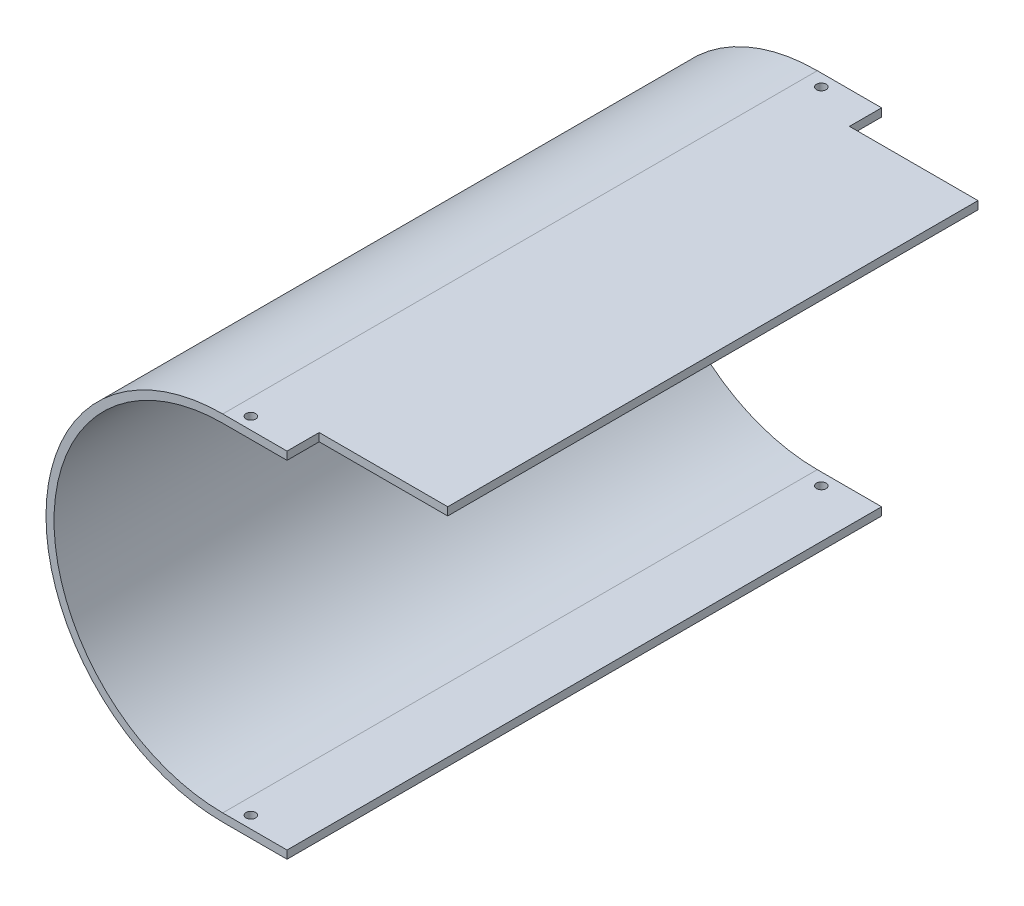
ISO-10303-21;
HEADER;
FILE_DESCRIPTION(('STEP AP214'),'2;1');
FILE_NAME('part.step','',(''),(''),'','','');
FILE_SCHEMA(('AUTOMOTIVE_DESIGN { 1 0 10303 214 1 1 1 1 }'));
ENDSEC;
DATA;
#1=APPLICATION_CONTEXT('core data for automotive mechanical design processes');
#2=APPLICATION_PROTOCOL_DEFINITION('international standard','automotive_design',2000,#1);
#3=PRODUCT_CONTEXT('',#1,'mechanical');
#4=PRODUCT('Part','Part','',(#3));
#5=PRODUCT_RELATED_PRODUCT_CATEGORY('part','',(#4));
#6=PRODUCT_DEFINITION_FORMATION('','',#4);
#7=PRODUCT_DEFINITION_CONTEXT('part definition',#1,'design');
#8=PRODUCT_DEFINITION('design','',#6,#7);
#9=PRODUCT_DEFINITION_SHAPE('','',#8);
#10=(LENGTH_UNIT() NAMED_UNIT(*) SI_UNIT(.MILLI.,.METRE.));
#11=(NAMED_UNIT(*) PLANE_ANGLE_UNIT() SI_UNIT($,.RADIAN.));
#12=(NAMED_UNIT(*) SI_UNIT($,.STERADIAN.) SOLID_ANGLE_UNIT());
#13=UNCERTAINTY_MEASURE_WITH_UNIT(LENGTH_MEASURE(1.E-05),#10,'distance_accuracy_value','');
#14=(GEOMETRIC_REPRESENTATION_CONTEXT(3) GLOBAL_UNCERTAINTY_ASSIGNED_CONTEXT((#13)) GLOBAL_UNIT_ASSIGNED_CONTEXT((#10,
#11,#12)) REPRESENTATION_CONTEXT('',''));
#15=CARTESIAN_POINT('',(0.,0.,0.));
#16=DIRECTION('',(0.,0.,1.));
#17=DIRECTION('',(1.,0.,0.));
#18=AXIS2_PLACEMENT_3D('',#15,#16,#17);
#19=CARTESIAN_POINT('',(-40.,0.,92.5));
#20=DIRECTION('',(1.,0.,0.));
#21=DIRECTION('',(0.,1.,0.));
#22=AXIS2_PLACEMENT_3D('',#19,#20,#21);
#23=PLANE('',#22);
#24=DIRECTION('',(0.,0.,-1.));
#25=VECTOR('',#24,1.);
#26=CARTESIAN_POINT('',(-40.,52.5,92.5));
#27=LINE('',#26,#25);
#28=CARTESIAN_POINT('',(-40.,52.5,92.5));
#29=VERTEX_POINT('',#28);
#30=CARTESIAN_POINT('',(-40.,52.5,82.5));
#31=VERTEX_POINT('',#30);
#32=EDGE_CURVE('E58',#29,#31,#27,.T.);
#33=ORIENTED_EDGE('',*,*,#32,.T.);
#34=DIRECTION('',(0.,1.,0.));
#35=VECTOR('',#34,1.);
#36=CARTESIAN_POINT('',(-40.,-117.279268463496,82.5));
#37=LINE('',#36,#35);
#38=CARTESIAN_POINT('',(-40.,55.,82.5));
#39=VERTEX_POINT('',#38);
#40=EDGE_CURVE('E162',#31,#39,#37,.T.);
#41=ORIENTED_EDGE('',*,*,#40,.T.);
#42=DIRECTION('',(0.,0.,-1.));
#43=VECTOR('',#42,1.);
#44=CARTESIAN_POINT('',(-40.,55.,92.5));
#45=LINE('',#44,#43);
#46=CARTESIAN_POINT('',(-40.,55.,92.5));
#47=VERTEX_POINT('',#46);
#48=EDGE_CURVE('E228',#47,#39,#45,.T.);
#49=ORIENTED_EDGE('',*,*,#48,.F.);
#50=DIRECTION('',(0.,-1.,0.));
#51=VECTOR('',#50,1.);
#52=CARTESIAN_POINT('',(-40.,0.,92.5));
#53=LINE('',#52,#51);
#54=EDGE_CURVE('E200',#47,#29,#53,.T.);
#55=ORIENTED_EDGE('',*,*,#54,.T.);
#56=EDGE_LOOP('',(#33,#41,#49,#55));
#57=FACE_BOUND('',#56,.T.);
#58=ADVANCED_FACE('F41',(#57),#23,.T.);
#59=CARTESIAN_POINT('',(0.,55.,92.5));
#60=DIRECTION('',(0.,1.,0.));
#61=DIRECTION('',(0.,0.,1.));
#62=AXIS2_PLACEMENT_3D('',#59,#60,#61);
#63=PLANE('',#62);
#64=CARTESIAN_POINT('',(-55.,55.,88.75));
#65=DIRECTION('',(0.,1.,0.));
#66=DIRECTION('',(0.,0.,-1.));
#67=AXIS2_PLACEMENT_3D('',#64,#65,#66);
#68=CIRCLE('',#67,1.5);
#69=CARTESIAN_POINT('',(-55.,55.,87.25));
#70=VERTEX_POINT('',#69);
#71=EDGE_CURVE('E167',#70,#70,#68,.T.);
#72=ORIENTED_EDGE('',*,*,#71,.F.);
#73=EDGE_LOOP('',(#72));
#74=FACE_BOUND('',#73,.T.);
#75=CARTESIAN_POINT('',(-55.,55.,-88.75));
#76=DIRECTION('',(0.,1.,0.));
#77=DIRECTION('',(0.,0.,1.));
#78=AXIS2_PLACEMENT_3D('',#75,#76,#77);
#79=CIRCLE('',#78,1.5);
#80=CARTESIAN_POINT('',(-55.,55.,-87.25));
#81=VERTEX_POINT('',#80);
#82=EDGE_CURVE('E173',#81,#81,#79,.T.);
#83=ORIENTED_EDGE('',*,*,#82,.F.);
#84=EDGE_LOOP('',(#83));
#85=FACE_BOUND('',#84,.T.);
#86=DIRECTION('',(1.,0.,0.));
#87=VECTOR('',#86,1.);
#88=CARTESIAN_POINT('',(0.,55.,-92.5));
#89=LINE('',#88,#87);
#90=CARTESIAN_POINT('',(-60.,55.,-92.5));
#91=VERTEX_POINT('',#90);
#92=CARTESIAN_POINT('',(-40.,55.,-92.5));
#93=VERTEX_POINT('',#92);
#94=EDGE_CURVE('E186',#91,#93,#89,.T.);
#95=ORIENTED_EDGE('',*,*,#94,.F.);
#96=DIRECTION('',(0.,0.,-1.));
#97=VECTOR('',#96,1.);
#98=CARTESIAN_POINT('',(-60.,55.,92.5));
#99=LINE('',#98,#97);
#100=CARTESIAN_POINT('',(-60.,55.,92.5));
#101=VERTEX_POINT('',#100);
#102=EDGE_CURVE('E11',#101,#91,#99,.T.);
#103=ORIENTED_EDGE('',*,*,#102,.F.);
#104=DIRECTION('',(1.,0.,0.));
#105=VECTOR('',#104,1.);
#106=CARTESIAN_POINT('',(0.,55.,92.5));
#107=LINE('',#106,#105);
#108=EDGE_CURVE('E187',#101,#47,#107,.T.);
#109=ORIENTED_EDGE('',*,*,#108,.T.);
#110=ORIENTED_EDGE('',*,*,#48,.T.);
#111=DIRECTION('',(-1.,0.,0.));
#112=VECTOR('',#111,1.);
#113=CARTESIAN_POINT('',(0.,55.,82.5));
#114=LINE('',#113,#112);
#115=CARTESIAN_POINT('',(0.,55.,82.5));
#116=VERTEX_POINT('',#115);
#117=EDGE_CURVE('E144',#116,#39,#114,.T.);
#118=ORIENTED_EDGE('',*,*,#117,.F.);
#119=DIRECTION('',(0.,0.,1.));
#120=VECTOR('',#119,1.);
#121=CARTESIAN_POINT('',(0.,55.,0.));
#122=LINE('',#121,#120);
#123=CARTESIAN_POINT('',(0.,55.,-82.5));
#124=VERTEX_POINT('',#123);
#125=EDGE_CURVE('E138',#124,#116,#122,.T.);
#126=ORIENTED_EDGE('',*,*,#125,.F.);
#127=DIRECTION('',(-1.,0.,0.));
#128=VECTOR('',#127,1.);
#129=CARTESIAN_POINT('',(0.,55.,-82.5));
#130=LINE('',#129,#128);
#131=CARTESIAN_POINT('',(-40.,55.,-82.5));
#132=VERTEX_POINT('',#131);
#133=EDGE_CURVE('E150',#124,#132,#130,.T.);
#134=ORIENTED_EDGE('',*,*,#133,.T.);
#135=EDGE_CURVE('E66',#132,#93,#45,.T.);
#136=ORIENTED_EDGE('',*,*,#135,.T.);
#137=EDGE_LOOP('',(#95,#103,#109,#110,#118,#126,#134,#136));
#138=FACE_BOUND('',#137,.T.);
#139=ADVANCED_FACE('F43',(#74,#85,#138),#63,.T.);
#140=CARTESIAN_POINT('',(-60.,0.,92.5));
#141=DIRECTION('',(0.,0.,-1.));
#142=DIRECTION('',(-1.,0.,0.));
#143=AXIS2_PLACEMENT_3D('',#140,#141,#142);
#144=CYLINDRICAL_SURFACE('',#143,55.);
#145=CARTESIAN_POINT('',(-60.,0.,-92.5));
#146=DIRECTION('',(0.,0.,1.));
#147=DIRECTION('',(1.,0.,0.));
#148=AXIS2_PLACEMENT_3D('',#145,#146,#147);
#149=CIRCLE('',#148,55.);
#150=CARTESIAN_POINT('',(-60.,-55.,-92.5));
#151=VERTEX_POINT('',#150);
#152=EDGE_CURVE('E210',#91,#151,#149,.T.);
#153=ORIENTED_EDGE('',*,*,#152,.T.);
#154=DIRECTION('',(0.,0.,-1.));
#155=VECTOR('',#154,1.);
#156=CARTESIAN_POINT('',(-60.,-55.,92.5));
#157=LINE('',#156,#155);
#158=CARTESIAN_POINT('',(-60.,-55.,92.5));
#159=VERTEX_POINT('',#158);
#160=EDGE_CURVE('E50',#159,#151,#157,.T.);
#161=ORIENTED_EDGE('',*,*,#160,.F.);
#162=CARTESIAN_POINT('',(-60.,0.,92.5));
#163=DIRECTION('',(0.,0.,1.));
#164=DIRECTION('',(1.,0.,0.));
#165=AXIS2_PLACEMENT_3D('',#162,#163,#164);
#166=CIRCLE('',#165,55.);
#167=EDGE_CURVE('E190',#101,#159,#166,.T.);
#168=ORIENTED_EDGE('',*,*,#167,.F.);
#169=ORIENTED_EDGE('',*,*,#102,.T.);
#170=EDGE_LOOP('',(#153,#161,#168,#169));
#171=FACE_BOUND('',#170,.T.);
#172=ADVANCED_FACE('F275',(#171),#144,.T.);
#173=CARTESIAN_POINT('',(0.,-55.,92.5));
#174=DIRECTION('',(0.,-1.,0.));
#175=DIRECTION('',(0.,0.,-1.));
#176=AXIS2_PLACEMENT_3D('',#173,#174,#175);
#177=PLANE('',#176);
#178=CARTESIAN_POINT('',(-55.,-55.,88.75));
#179=DIRECTION('',(0.,1.,0.));
#180=DIRECTION('',(0.,0.,-1.));
#181=AXIS2_PLACEMENT_3D('',#178,#179,#180);
#182=CIRCLE('',#181,1.5);
#183=CARTESIAN_POINT('',(-55.,-55.,87.25));
#184=VERTEX_POINT('',#183);
#185=EDGE_CURVE('E170',#184,#184,#182,.T.);
#186=ORIENTED_EDGE('',*,*,#185,.T.);
#187=EDGE_LOOP('',(#186));
#188=FACE_BOUND('',#187,.T.);
#189=CARTESIAN_POINT('',(-55.,-55.,-88.75));
#190=DIRECTION('',(0.,1.,0.));
#191=DIRECTION('',(0.,0.,1.));
#192=AXIS2_PLACEMENT_3D('',#189,#190,#191);
#193=CIRCLE('',#192,1.5);
#194=CARTESIAN_POINT('',(-55.,-55.,-87.25));
#195=VERTEX_POINT('',#194);
#196=EDGE_CURVE('E176',#195,#195,#193,.T.);
#197=ORIENTED_EDGE('',*,*,#196,.T.);
#198=EDGE_LOOP('',(#197));
#199=FACE_BOUND('',#198,.T.);
#200=DIRECTION('',(-1.,0.,0.));
#201=VECTOR('',#200,1.);
#202=CARTESIAN_POINT('',(0.,-55.,-92.5));
#203=LINE('',#202,#201);
#204=CARTESIAN_POINT('',(-40.,-55.,-92.5));
#205=VERTEX_POINT('',#204);
#206=EDGE_CURVE('E213',#205,#151,#203,.T.);
#207=ORIENTED_EDGE('',*,*,#206,.F.);
#208=DIRECTION('',(0.,0.,-1.));
#209=VECTOR('',#208,1.);
#210=CARTESIAN_POINT('',(-40.,-55.,92.5));
#211=LINE('',#210,#209);
#212=CARTESIAN_POINT('',(-40.,-55.,92.5));
#213=VERTEX_POINT('',#212);
#214=EDGE_CURVE('E238',#213,#205,#211,.T.);
#215=ORIENTED_EDGE('',*,*,#214,.F.);
#216=DIRECTION('',(-1.,0.,0.));
#217=VECTOR('',#216,1.);
#218=CARTESIAN_POINT('',(0.,-55.,92.5));
#219=LINE('',#218,#217);
#220=EDGE_CURVE('E193',#213,#159,#219,.T.);
#221=ORIENTED_EDGE('',*,*,#220,.T.);
#222=ORIENTED_EDGE('',*,*,#160,.T.);
#223=EDGE_LOOP('',(#207,#215,#221,#222));
#224=FACE_BOUND('',#223,.T.);
#225=ADVANCED_FACE('F280',(#188,#199,#224),#177,.T.);
#226=DIRECTION('',(0.,-1.,0.));
#227=VECTOR('',#226,1.);
#228=CARTESIAN_POINT('',(-40.,0.,-92.5));
#229=LINE('',#228,#227);
#230=CARTESIAN_POINT('',(-40.,-52.5,-92.5));
#231=VERTEX_POINT('',#230);
#232=EDGE_CURVE('E216',#231,#205,#229,.T.);
#233=ORIENTED_EDGE('',*,*,#232,.F.);
#234=DIRECTION('',(0.,0.,-1.));
#235=VECTOR('',#234,1.);
#236=CARTESIAN_POINT('',(-40.,-52.5,92.5));
#237=LINE('',#236,#235);
#238=CARTESIAN_POINT('',(-40.,-52.5,92.5));
#239=VERTEX_POINT('',#238);
#240=EDGE_CURVE('E236',#239,#231,#237,.T.);
#241=ORIENTED_EDGE('',*,*,#240,.F.);
#242=EDGE_CURVE('E196',#239,#213,#53,.T.);
#243=ORIENTED_EDGE('',*,*,#242,.T.);
#244=ORIENTED_EDGE('',*,*,#214,.T.);
#245=EDGE_LOOP('',(#233,#241,#243,#244));
#246=FACE_BOUND('',#245,.T.);
#247=ADVANCED_FACE('F268',(#246),#23,.T.);
#248=CARTESIAN_POINT('',(0.,-52.5,92.5));
#249=DIRECTION('',(0.,1.,0.));
#250=DIRECTION('',(0.,0.,1.));
#251=AXIS2_PLACEMENT_3D('',#248,#249,#250);
#252=PLANE('',#251);
#253=CARTESIAN_POINT('',(-55.,-52.5,88.75));
#254=DIRECTION('',(0.,1.,0.));
#255=DIRECTION('',(0.,0.,1.));
#256=AXIS2_PLACEMENT_3D('',#253,#254,#255);
#257=CIRCLE('',#256,1.5);
#258=CARTESIAN_POINT('',(-55.,-52.5,90.25));
#259=VERTEX_POINT('',#258);
#260=EDGE_CURVE('E183',#259,#259,#257,.T.);
#261=ORIENTED_EDGE('',*,*,#260,.F.);
#262=EDGE_LOOP('',(#261));
#263=FACE_BOUND('',#262,.T.);
#264=CARTESIAN_POINT('',(-55.,-52.5,-88.75));
#265=DIRECTION('',(0.,1.,0.));
#266=DIRECTION('',(0.,0.,1.));
#267=AXIS2_PLACEMENT_3D('',#264,#265,#266);
#268=CIRCLE('',#267,1.5);
#269=CARTESIAN_POINT('',(-55.,-52.5,-87.25));
#270=VERTEX_POINT('',#269);
#271=EDGE_CURVE('E180',#270,#270,#268,.T.);
#272=ORIENTED_EDGE('',*,*,#271,.F.);
#273=EDGE_LOOP('',(#272));
#274=FACE_BOUND('',#273,.T.);
#275=DIRECTION('',(1.,0.,0.));
#276=VECTOR('',#275,1.);
#277=CARTESIAN_POINT('',(0.,-52.5,-92.5));
#278=LINE('',#277,#276);
#279=CARTESIAN_POINT('',(-60.,-52.5,-92.5));
#280=VERTEX_POINT('',#279);
#281=EDGE_CURVE('E219',#280,#231,#278,.T.);
#282=ORIENTED_EDGE('',*,*,#281,.F.);
#283=DIRECTION('',(0.,0.,-1.));
#284=VECTOR('',#283,1.);
#285=CARTESIAN_POINT('',(-60.,-52.5,92.5));
#286=LINE('',#285,#284);
#287=CARTESIAN_POINT('',(-60.,-52.5,92.5));
#288=VERTEX_POINT('',#287);
#289=EDGE_CURVE('E234',#288,#280,#286,.T.);
#290=ORIENTED_EDGE('',*,*,#289,.F.);
#291=DIRECTION('',(1.,0.,0.));
#292=VECTOR('',#291,1.);
#293=CARTESIAN_POINT('',(0.,-52.5,92.5));
#294=LINE('',#293,#292);
#295=EDGE_CURVE('E199',#288,#239,#294,.T.);
#296=ORIENTED_EDGE('',*,*,#295,.T.);
#297=ORIENTED_EDGE('',*,*,#240,.T.);
#298=EDGE_LOOP('',(#282,#290,#296,#297));
#299=FACE_BOUND('',#298,.T.);
#300=ADVANCED_FACE('F279',(#263,#274,#299),#252,.T.);
#301=CARTESIAN_POINT('',(-60.,0.,92.5));
#302=DIRECTION('',(0.,0.,-1.));
#303=DIRECTION('',(-1.,0.,0.));
#304=AXIS2_PLACEMENT_3D('',#301,#302,#303);
#305=CYLINDRICAL_SURFACE('',#304,52.5);
#306=CARTESIAN_POINT('',(-60.,0.,-92.5));
#307=DIRECTION('',(0.,0.,1.));
#308=DIRECTION('',(1.,0.,0.));
#309=AXIS2_PLACEMENT_3D('',#306,#307,#308);
#310=CIRCLE('',#309,52.5);
#311=CARTESIAN_POINT('',(-60.,52.5,-92.5));
#312=VERTEX_POINT('',#311);
#313=EDGE_CURVE('E222',#312,#280,#310,.T.);
#314=ORIENTED_EDGE('',*,*,#313,.F.);
#315=DIRECTION('',(0.,0.,-1.));
#316=VECTOR('',#315,1.);
#317=CARTESIAN_POINT('',(-60.,52.5,92.5));
#318=LINE('',#317,#316);
#319=CARTESIAN_POINT('',(-60.,52.5,92.5));
#320=VERTEX_POINT('',#319);
#321=EDGE_CURVE('E232',#320,#312,#318,.T.);
#322=ORIENTED_EDGE('',*,*,#321,.F.);
#323=CARTESIAN_POINT('',(-60.,0.,92.5));
#324=DIRECTION('',(0.,0.,1.));
#325=DIRECTION('',(1.,0.,0.));
#326=AXIS2_PLACEMENT_3D('',#323,#324,#325);
#327=CIRCLE('',#326,52.5);
#328=EDGE_CURVE('E203',#320,#288,#327,.T.);
#329=ORIENTED_EDGE('',*,*,#328,.T.);
#330=ORIENTED_EDGE('',*,*,#289,.T.);
#331=EDGE_LOOP('',(#314,#322,#329,#330));
#332=FACE_BOUND('',#331,.T.);
#333=ADVANCED_FACE('F290',(#332),#305,.F.);
#334=CARTESIAN_POINT('',(0.,52.5,92.5));
#335=DIRECTION('',(0.,1.,0.));
#336=DIRECTION('',(0.,0.,1.));
#337=AXIS2_PLACEMENT_3D('',#334,#335,#336);
#338=PLANE('',#337);
#339=CARTESIAN_POINT('',(-55.,52.5,88.75));
#340=DIRECTION('',(0.,1.,0.));
#341=DIRECTION('',(0.,0.,1.));
#342=AXIS2_PLACEMENT_3D('',#339,#340,#341);
#343=CIRCLE('',#342,1.5);
#344=CARTESIAN_POINT('',(-55.,52.5,90.25));
#345=VERTEX_POINT('',#344);
#346=EDGE_CURVE('E45',#345,#345,#343,.T.);
#347=ORIENTED_EDGE('',*,*,#346,.T.);
#348=EDGE_LOOP('',(#347));
#349=FACE_BOUND('',#348,.T.);
#350=CARTESIAN_POINT('',(-55.,52.5,-88.75));
#351=DIRECTION('',(0.,1.,0.));
#352=DIRECTION('',(0.,0.,1.));
#353=AXIS2_PLACEMENT_3D('',#350,#351,#352);
#354=CIRCLE('',#353,1.5);
#355=CARTESIAN_POINT('',(-55.,52.5,-87.25));
#356=VERTEX_POINT('',#355);
#357=EDGE_CURVE('E179',#356,#356,#354,.T.);
#358=ORIENTED_EDGE('',*,*,#357,.T.);
#359=EDGE_LOOP('',(#358));
#360=FACE_BOUND('',#359,.T.);
#361=DIRECTION('',(1.,0.,0.));
#362=VECTOR('',#361,1.);
#363=CARTESIAN_POINT('',(0.,52.5,-92.5));
#364=LINE('',#363,#362);
#365=CARTESIAN_POINT('',(-40.,52.5,-92.5));
#366=VERTEX_POINT('',#365);
#367=EDGE_CURVE('E225',#312,#366,#364,.T.);
#368=ORIENTED_EDGE('',*,*,#367,.T.);
#369=CARTESIAN_POINT('',(-40.,52.5,-82.5));
#370=VERTEX_POINT('',#369);
#371=EDGE_CURVE('E230',#370,#366,#27,.T.);
#372=ORIENTED_EDGE('',*,*,#371,.F.);
#373=DIRECTION('',(1.,0.,0.));
#374=VECTOR('',#373,1.);
#375=CARTESIAN_POINT('',(0.,52.5,-82.5));
#376=LINE('',#375,#374);
#377=CARTESIAN_POINT('',(0.,52.5,-82.5));
#378=VERTEX_POINT('',#377);
#379=EDGE_CURVE('E165',#370,#378,#376,.T.);
#380=ORIENTED_EDGE('',*,*,#379,.T.);
#381=DIRECTION('',(0.,0.,-1.));
#382=VECTOR('',#381,1.);
#383=CARTESIAN_POINT('',(0.,52.5,0.));
#384=LINE('',#383,#382);
#385=CARTESIAN_POINT('',(0.,52.5,82.5));
#386=VERTEX_POINT('',#385);
#387=EDGE_CURVE('E139',#386,#378,#384,.T.);
#388=ORIENTED_EDGE('',*,*,#387,.F.);
#389=DIRECTION('',(1.,0.,0.));
#390=VECTOR('',#389,1.);
#391=CARTESIAN_POINT('',(0.,52.5,82.5));
#392=LINE('',#391,#390);
#393=EDGE_CURVE('E161',#31,#386,#392,.T.);
#394=ORIENTED_EDGE('',*,*,#393,.F.);
#395=ORIENTED_EDGE('',*,*,#32,.F.);
#396=DIRECTION('',(1.,0.,0.));
#397=VECTOR('',#396,1.);
#398=CARTESIAN_POINT('',(0.,52.5,92.5));
#399=LINE('',#398,#397);
#400=EDGE_CURVE('E206',#320,#29,#399,.T.);
#401=ORIENTED_EDGE('',*,*,#400,.F.);
#402=ORIENTED_EDGE('',*,*,#321,.T.);
#403=EDGE_LOOP('',(#368,#372,#380,#388,#394,#395,#401,#402));
#404=FACE_BOUND('',#403,.T.);
#405=ADVANCED_FACE('F243',(#349,#360,#404),#338,.F.);
#406=DIRECTION('',(0.,1.,0.));
#407=VECTOR('',#406,1.);
#408=CARTESIAN_POINT('',(-40.,-117.279268463496,-82.5));
#409=LINE('',#408,#407);
#410=EDGE_CURVE('E143',#370,#132,#409,.T.);
#411=ORIENTED_EDGE('',*,*,#410,.F.);
#412=ORIENTED_EDGE('',*,*,#371,.T.);
#413=EDGE_CURVE('E191',#93,#366,#229,.T.);
#414=ORIENTED_EDGE('',*,*,#413,.F.);
#415=ORIENTED_EDGE('',*,*,#135,.F.);
#416=EDGE_LOOP('',(#411,#412,#414,#415));
#417=FACE_BOUND('',#416,.T.);
#418=ADVANCED_FACE('F269',(#417),#23,.T.);
#419=CARTESIAN_POINT('',(0.,0.,92.5));
#420=DIRECTION('',(0.,0.,1.));
#421=DIRECTION('',(1.,0.,0.));
#422=AXIS2_PLACEMENT_3D('',#419,#420,#421);
#423=PLANE('',#422);
#424=ORIENTED_EDGE('',*,*,#108,.F.);
#425=ORIENTED_EDGE('',*,*,#167,.T.);
#426=ORIENTED_EDGE('',*,*,#220,.F.);
#427=ORIENTED_EDGE('',*,*,#242,.F.);
#428=ORIENTED_EDGE('',*,*,#295,.F.);
#429=ORIENTED_EDGE('',*,*,#328,.F.);
#430=ORIENTED_EDGE('',*,*,#400,.T.);
#431=ORIENTED_EDGE('',*,*,#54,.F.);
#432=EDGE_LOOP('',(#424,#425,#426,#427,#428,#429,#430,#431));
#433=FACE_BOUND('',#432,.T.);
#434=ADVANCED_FACE('F260',(#433),#423,.T.);
#435=CARTESIAN_POINT('',(0.,0.,-92.5));
#436=DIRECTION('',(0.,0.,1.));
#437=DIRECTION('',(1.,0.,0.));
#438=AXIS2_PLACEMENT_3D('',#435,#436,#437);
#439=PLANE('',#438);
#440=ORIENTED_EDGE('',*,*,#94,.T.);
#441=ORIENTED_EDGE('',*,*,#413,.T.);
#442=ORIENTED_EDGE('',*,*,#367,.F.);
#443=ORIENTED_EDGE('',*,*,#313,.T.);
#444=ORIENTED_EDGE('',*,*,#281,.T.);
#445=ORIENTED_EDGE('',*,*,#232,.T.);
#446=ORIENTED_EDGE('',*,*,#206,.T.);
#447=ORIENTED_EDGE('',*,*,#152,.F.);
#448=EDGE_LOOP('',(#440,#441,#442,#443,#444,#445,#446,#447));
#449=FACE_BOUND('',#448,.T.);
#450=ADVANCED_FACE('F249',(#449),#439,.F.);
#451=CARTESIAN_POINT('',(-55.,-55.,-88.75));
#452=DIRECTION('',(0.,1.,0.));
#453=DIRECTION('',(0.,0.,1.));
#454=AXIS2_PLACEMENT_3D('',#451,#452,#453);
#455=CYLINDRICAL_SURFACE('',#454,1.5);
#456=ORIENTED_EDGE('',*,*,#82,.T.);
#457=EDGE_LOOP('',(#456));
#458=FACE_BOUND('',#457,.T.);
#459=ORIENTED_EDGE('',*,*,#357,.F.);
#460=EDGE_LOOP('',(#459));
#461=FACE_BOUND('',#460,.T.);
#462=ADVANCED_FACE('F246',(#458,#461),#455,.F.);
#463=CARTESIAN_POINT('',(-55.,-55.,88.75));
#464=DIRECTION('',(0.,1.,0.));
#465=DIRECTION('',(0.,0.,1.));
#466=AXIS2_PLACEMENT_3D('',#463,#464,#465);
#467=CYLINDRICAL_SURFACE('',#466,1.5);
#468=ORIENTED_EDGE('',*,*,#71,.T.);
#469=EDGE_LOOP('',(#468));
#470=FACE_BOUND('',#469,.T.);
#471=ORIENTED_EDGE('',*,*,#346,.F.);
#472=EDGE_LOOP('',(#471));
#473=FACE_BOUND('',#472,.T.);
#474=ADVANCED_FACE('F248',(#470,#473),#467,.F.);
#475=ORIENTED_EDGE('',*,*,#271,.T.);
#476=EDGE_LOOP('',(#475));
#477=FACE_BOUND('',#476,.T.);
#478=ORIENTED_EDGE('',*,*,#196,.F.);
#479=EDGE_LOOP('',(#478));
#480=FACE_BOUND('',#479,.T.);
#481=ADVANCED_FACE('F252',(#477,#480),#455,.F.);
#482=ORIENTED_EDGE('',*,*,#260,.T.);
#483=EDGE_LOOP('',(#482));
#484=FACE_BOUND('',#483,.T.);
#485=ORIENTED_EDGE('',*,*,#185,.F.);
#486=EDGE_LOOP('',(#485));
#487=FACE_BOUND('',#486,.T.);
#488=ADVANCED_FACE('F259',(#484,#487),#467,.F.);
#489=CARTESIAN_POINT('',(0.,-117.279268463496,0.));
#490=DIRECTION('',(-1.,0.,0.));
#491=DIRECTION('',(0.,0.,1.));
#492=AXIS2_PLACEMENT_3D('',#489,#490,#491);
#493=PLANE('',#492);
#494=DIRECTION('',(0.,1.,0.));
#495=VECTOR('',#494,1.);
#496=CARTESIAN_POINT('',(0.,-117.279268463496,82.5));
#497=LINE('',#496,#495);
#498=EDGE_CURVE('E159',#386,#116,#497,.T.);
#499=ORIENTED_EDGE('',*,*,#498,.F.);
#500=ORIENTED_EDGE('',*,*,#387,.T.);
#501=DIRECTION('',(0.,1.,0.));
#502=VECTOR('',#501,1.);
#503=CARTESIAN_POINT('',(0.,-117.279268463496,-82.5));
#504=LINE('',#503,#502);
#505=EDGE_CURVE('E134',#378,#124,#504,.T.);
#506=ORIENTED_EDGE('',*,*,#505,.T.);
#507=ORIENTED_EDGE('',*,*,#125,.T.);
#508=EDGE_LOOP('',(#499,#500,#506,#507));
#509=FACE_BOUND('',#508,.T.);
#510=ADVANCED_FACE('F137',(#509),#493,.F.);
#511=CARTESIAN_POINT('',(0.,-117.279268463496,82.5));
#512=DIRECTION('',(0.,0.,-1.));
#513=DIRECTION('',(-1.,0.,0.));
#514=AXIS2_PLACEMENT_3D('',#511,#512,#513);
#515=PLANE('',#514);
#516=ORIENTED_EDGE('',*,*,#40,.F.);
#517=ORIENTED_EDGE('',*,*,#393,.T.);
#518=ORIENTED_EDGE('',*,*,#498,.T.);
#519=ORIENTED_EDGE('',*,*,#117,.T.);
#520=EDGE_LOOP('',(#516,#517,#518,#519));
#521=FACE_BOUND('',#520,.T.);
#522=ADVANCED_FACE('F306',(#521),#515,.F.);
#523=CARTESIAN_POINT('',(0.,-117.279268463496,-82.5));
#524=DIRECTION('',(0.,0.,-1.));
#525=DIRECTION('',(-1.,0.,0.));
#526=AXIS2_PLACEMENT_3D('',#523,#524,#525);
#527=PLANE('',#526);
#528=ORIENTED_EDGE('',*,*,#379,.F.);
#529=ORIENTED_EDGE('',*,*,#410,.T.);
#530=ORIENTED_EDGE('',*,*,#133,.F.);
#531=ORIENTED_EDGE('',*,*,#505,.F.);
#532=EDGE_LOOP('',(#528,#529,#530,#531));
#533=FACE_BOUND('',#532,.T.);
#534=ADVANCED_FACE('F154',(#533),#527,.T.);
#535=CLOSED_SHELL('',(#58,#139,#172,#225,#247,#300,#333,#405,#418,#434,#450,#462,#474,#481,#488,
#510,#522,#534));
#536=MANIFOLD_SOLID_BREP('B2',#535);
#537=ADVANCED_BREP_SHAPE_REPRESENTATION('',(#18,#536),#14);
#538=SHAPE_DEFINITION_REPRESENTATION(#9,#537);
ENDSEC;
END-ISO-10303-21;
